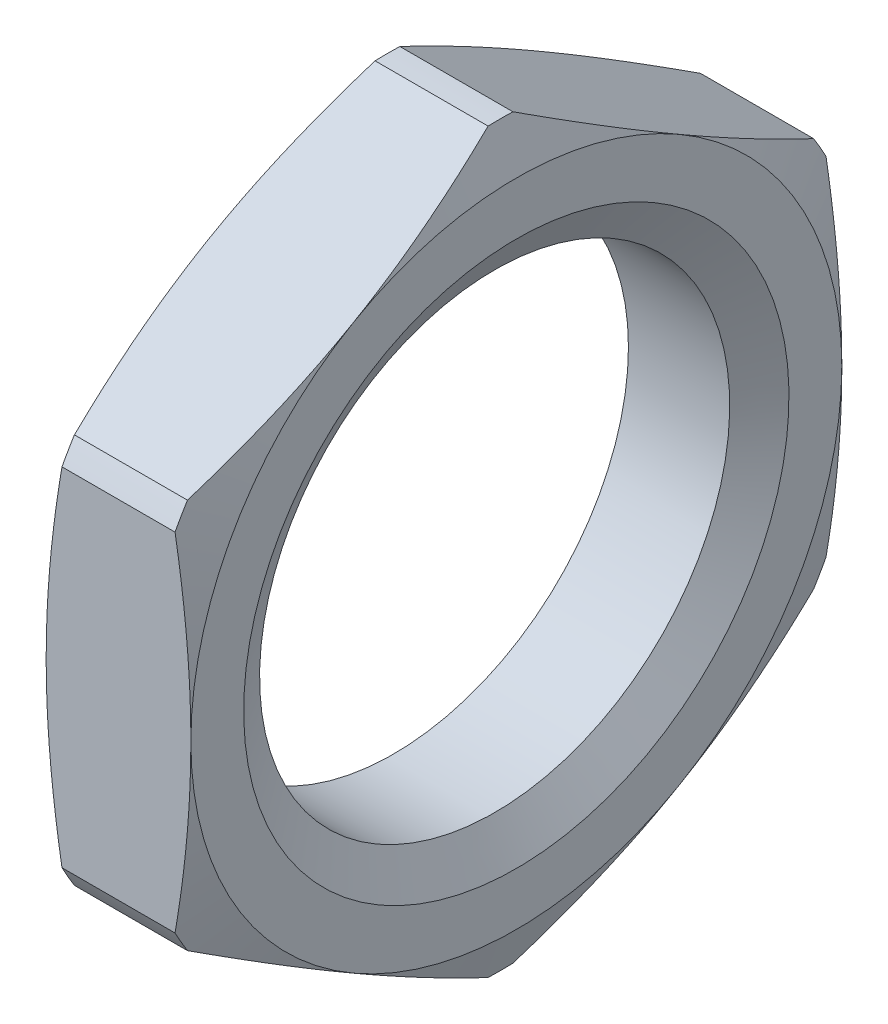
ISO-10303-21;
HEADER;
FILE_DESCRIPTION(('STEP AP214'),'2;1');
FILE_NAME('part.step','',(''),(''),'','','');
FILE_SCHEMA(('AUTOMOTIVE_DESIGN { 1 0 10303 214 1 1 1 1 }'));
ENDSEC;
DATA;
#1=APPLICATION_CONTEXT('core data for automotive mechanical design processes');
#2=APPLICATION_PROTOCOL_DEFINITION('international standard','automotive_design',2000,#1);
#3=PRODUCT_CONTEXT('',#1,'mechanical');
#4=PRODUCT('Part','Part','',(#3));
#5=PRODUCT_RELATED_PRODUCT_CATEGORY('part','',(#4));
#6=PRODUCT_DEFINITION_FORMATION('','',#4);
#7=PRODUCT_DEFINITION_CONTEXT('part definition',#1,'design');
#8=PRODUCT_DEFINITION('design','',#6,#7);
#9=PRODUCT_DEFINITION_SHAPE('','',#8);
#10=(LENGTH_UNIT() NAMED_UNIT(*) SI_UNIT(.MILLI.,.METRE.));
#11=(NAMED_UNIT(*) PLANE_ANGLE_UNIT() SI_UNIT($,.RADIAN.));
#12=(NAMED_UNIT(*) SI_UNIT($,.STERADIAN.) SOLID_ANGLE_UNIT());
#13=UNCERTAINTY_MEASURE_WITH_UNIT(LENGTH_MEASURE(1.E-05),#10,'distance_accuracy_value','');
#14=(GEOMETRIC_REPRESENTATION_CONTEXT(3) GLOBAL_UNCERTAINTY_ASSIGNED_CONTEXT((#13)) GLOBAL_UNIT_ASSIGNED_CONTEXT((#10,
#11,#12)) REPRESENTATION_CONTEXT('',''));
#15=CARTESIAN_POINT('',(0.,0.,0.));
#16=DIRECTION('',(0.,0.,1.));
#17=DIRECTION('',(1.,0.,0.));
#18=AXIS2_PLACEMENT_3D('',#15,#16,#17);
#19=CARTESIAN_POINT('',(-8.5,0.,0.));
#20=DIRECTION('',(1.,0.,0.));
#21=DIRECTION('',(0.,0.866025403784439,-0.5));
#22=AXIS2_PLACEMENT_3D('',#19,#20,#21);
#23=CYLINDRICAL_SURFACE('',#22,5.1);
#24=DIRECTION('',(-1.,0.,0.));
#25=VECTOR('',#24,1.);
#26=CARTESIAN_POINT('',(-8.5,2.4,-4.5));
#27=LINE('',#26,#25);
#28=CARTESIAN_POINT('',(-7.71838214055972,2.4,-4.5));
#29=VERTEX_POINT('',#28);
#30=CARTESIAN_POINT('',(-9.28161785944028,2.4,-4.5));
#31=VERTEX_POINT('',#30);
#32=EDGE_CURVE('E237',#29,#31,#27,.T.);
#33=ORIENTED_EDGE('',*,*,#32,.T.);
#34=CARTESIAN_POINT('',(-9.28161785944028,0.,0.));
#35=DIRECTION('',(-1.,0.,0.));
#36=DIRECTION('',(0.,-0.866025403784439,0.5));
#37=AXIS2_PLACEMENT_3D('',#34,#35,#36);
#38=CIRCLE('',#37,5.1);
#39=CARTESIAN_POINT('',(-9.28161785944028,2.69711431702997,-4.32846096908265));
#40=VERTEX_POINT('',#39);
#41=EDGE_CURVE('E201',#40,#31,#38,.T.);
#42=ORIENTED_EDGE('',*,*,#41,.F.);
#43=DIRECTION('',(1.,0.,0.));
#44=VECTOR('',#43,1.);
#45=CARTESIAN_POINT('',(-8.5,2.69711431702997,-4.32846096908265));
#46=LINE('',#45,#44);
#47=CARTESIAN_POINT('',(-7.71838214055972,2.69711431702997,-4.32846096908265));
#48=VERTEX_POINT('',#47);
#49=EDGE_CURVE('E362',#40,#48,#46,.T.);
#50=ORIENTED_EDGE('',*,*,#49,.T.);
#51=CARTESIAN_POINT('',(-7.71838214055972,0.,0.));
#52=DIRECTION('',(1.,0.,0.));
#53=DIRECTION('',(0.,-0.866025403784439,0.5));
#54=AXIS2_PLACEMENT_3D('',#51,#52,#53);
#55=CIRCLE('',#54,5.1);
#56=EDGE_CURVE('E11',#29,#48,#55,.T.);
#57=ORIENTED_EDGE('',*,*,#56,.F.);
#58=EDGE_LOOP('',(#33,#42,#50,#57));
#59=FACE_BOUND('',#58,.T.);
#60=ADVANCED_FACE('F16',(#59),#23,.T.);
#61=CARTESIAN_POINT('',(-7.60919107027986,0.,0.));
#62=DIRECTION('',(-1.,0.,0.));
#63=DIRECTION('',(0.,-0.866025403784439,0.5));
#64=AXIS2_PLACEMENT_3D('',#61,#62,#63);
#65=CONICAL_SURFACE('',#64,4.8,1.22173047639603);
#66=CARTESIAN_POINT('',(-7.5,0.,-4.5));
#67=CARTESIAN_POINT('',(-7.5,1.12499999999998,-4.5));
#68=CARTESIAN_POINT('',(-7.71838214055972,2.4,-4.5));
#69=(BOUNDED_CURVE() B_SPLINE_CURVE(2,(#66,#67,#68),.UNSPECIFIED.,.F.,
.F.) B_SPLINE_CURVE_WITH_KNOTS((3,3),(0.241214330526774,0.482428661053548),
.UNSPECIFIED.) CURVE() GEOMETRIC_REPRESENTATION_ITEM() RATIONAL_B_SPLINE_CURVE((1.,
1.03279555898864,1.)) REPRESENTATION_ITEM(''));
#70=CARTESIAN_POINT('',(-7.5,0.,-4.5));
#71=VERTEX_POINT('',#70);
#72=EDGE_CURVE('E421',#71,#29,#69,.T.);
#73=ORIENTED_EDGE('',*,*,#72,.T.);
#74=ORIENTED_EDGE('',*,*,#56,.T.);
#75=CARTESIAN_POINT('',(-7.71838214055972,2.69711431702997,-4.32846096908265));
#76=CARTESIAN_POINT('',(-7.50000000000001,3.33461431702997,-3.22427857925749));
#77=CARTESIAN_POINT('',(-7.5,3.89711431702997,-2.25));
#78=(BOUNDED_CURVE() B_SPLINE_CURVE(2,(#75,#76,#77),.UNSPECIFIED.,.F.,
.F.) B_SPLINE_CURVE_WITH_KNOTS((3,3),(0.,0.241214330526774),
.UNSPECIFIED.) CURVE() GEOMETRIC_REPRESENTATION_ITEM() RATIONAL_B_SPLINE_CURVE((1.,
1.03279555898865,1.)) REPRESENTATION_ITEM(''));
#79=CARTESIAN_POINT('',(-7.5,3.89711431702997,-2.25));
#80=VERTEX_POINT('',#79);
#81=EDGE_CURVE('E353',#48,#80,#78,.T.);
#82=ORIENTED_EDGE('',*,*,#81,.T.);
#83=CARTESIAN_POINT('',(-7.5,0.,0.));
#84=DIRECTION('',(-1.,0.,0.));
#85=DIRECTION('',(0.,-0.866025403784439,0.5));
#86=AXIS2_PLACEMENT_3D('',#83,#84,#85);
#87=CIRCLE('',#86,4.5);
#88=EDGE_CURVE('E337',#80,#71,#87,.T.);
#89=ORIENTED_EDGE('',*,*,#88,.T.);
#90=EDGE_LOOP('',(#73,#74,#82,#89));
#91=FACE_BOUND('',#90,.T.);
#92=ADVANCED_FACE('F628',(#91),#65,.T.);
#93=CARTESIAN_POINT('',(-9.5,2.20836477965031,-1.275));
#94=DIRECTION('',(-1.,0.,0.));
#95=DIRECTION('',(0.,0.866025403784439,-0.5));
#96=AXIS2_PLACEMENT_3D('',#93,#94,#95);
#97=PLANE('',#96);
#98=CARTESIAN_POINT('',(-9.5,0.,0.));
#99=DIRECTION('',(-1.,0.,0.));
#100=DIRECTION('',(0.,0.866025403784439,-0.5));
#101=AXIS2_PLACEMENT_3D('',#98,#99,#100);
#102=CIRCLE('',#101,3.76961524227066);
#103=CARTESIAN_POINT('',(-9.5,-3.26458256229944,1.88480762113533));
#104=VERTEX_POINT('',#103);
#105=EDGE_CURVE('E29',#104,#104,#102,.T.);
#106=ORIENTED_EDGE('',*,*,#105,.F.);
#107=EDGE_LOOP('',(#106));
#108=FACE_BOUND('',#107,.T.);
#109=CARTESIAN_POINT('',(-9.5,0.,0.));
#110=DIRECTION('',(1.,0.,0.));
#111=DIRECTION('',(0.,-0.866025403784439,0.5));
#112=AXIS2_PLACEMENT_3D('',#109,#110,#111);
#113=CIRCLE('',#112,4.5);
#114=CARTESIAN_POINT('',(-9.5,3.89711431702997,-2.25));
#115=VERTEX_POINT('',#114);
#116=CARTESIAN_POINT('',(-9.5,3.89711431702997,2.25));
#117=VERTEX_POINT('',#116);
#118=EDGE_CURVE('E274',#115,#117,#113,.T.);
#119=ORIENTED_EDGE('',*,*,#118,.F.);
#120=CARTESIAN_POINT('',(-9.5,0.,0.));
#121=DIRECTION('',(1.,0.,0.));
#122=DIRECTION('',(0.,-0.866025403784439,0.5));
#123=AXIS2_PLACEMENT_3D('',#120,#121,#122);
#124=CIRCLE('',#123,4.5);
#125=CARTESIAN_POINT('',(-9.5,0.,-4.5));
#126=VERTEX_POINT('',#125);
#127=EDGE_CURVE('E196',#126,#115,#124,.T.);
#128=ORIENTED_EDGE('',*,*,#127,.F.);
#129=CARTESIAN_POINT('',(-9.5,0.,0.));
#130=DIRECTION('',(1.,0.,0.));
#131=DIRECTION('',(0.,-0.866025403784439,0.5));
#132=AXIS2_PLACEMENT_3D('',#129,#130,#131);
#133=CIRCLE('',#132,4.5);
#134=CARTESIAN_POINT('',(-9.5,-3.89711431702999,-2.25));
#135=VERTEX_POINT('',#134);
#136=EDGE_CURVE('E297',#135,#126,#133,.T.);
#137=ORIENTED_EDGE('',*,*,#136,.F.);
#138=CARTESIAN_POINT('',(-9.5,0.,0.));
#139=DIRECTION('',(1.,0.,0.));
#140=DIRECTION('',(0.,-0.866025403784439,0.5));
#141=AXIS2_PLACEMENT_3D('',#138,#139,#140);
#142=CIRCLE('',#141,4.5);
#143=CARTESIAN_POINT('',(-9.5,-3.89711431702999,2.25));
#144=VERTEX_POINT('',#143);
#145=EDGE_CURVE('E305',#144,#135,#142,.T.);
#146=ORIENTED_EDGE('',*,*,#145,.F.);
#147=CARTESIAN_POINT('',(-9.5,0.,0.));
#148=DIRECTION('',(1.,0.,0.));
#149=DIRECTION('',(0.,-0.866025403784439,0.5));
#150=AXIS2_PLACEMENT_3D('',#147,#148,#149);
#151=CIRCLE('',#150,4.5);
#152=CARTESIAN_POINT('',(-9.5,0.,4.5));
#153=VERTEX_POINT('',#152);
#154=EDGE_CURVE('E251',#153,#144,#151,.T.);
#155=ORIENTED_EDGE('',*,*,#154,.F.);
#156=CARTESIAN_POINT('',(-9.5,0.,0.));
#157=DIRECTION('',(1.,0.,0.));
#158=DIRECTION('',(0.,-0.866025403784439,0.5));
#159=AXIS2_PLACEMENT_3D('',#156,#157,#158);
#160=CIRCLE('',#159,4.5);
#161=EDGE_CURVE('E252',#117,#153,#160,.T.);
#162=ORIENTED_EDGE('',*,*,#161,.F.);
#163=EDGE_LOOP('',(#119,#128,#137,#146,#155,#162));
#164=FACE_BOUND('',#163,.T.);
#165=ADVANCED_FACE('F632',(#108,#164),#97,.T.);
#166=CARTESIAN_POINT('',(-9.35,0.,0.));
#167=DIRECTION('',(-1.,0.,0.));
#168=DIRECTION('',(0.,0.866025403784439,-0.5));
#169=AXIS2_PLACEMENT_3D('',#166,#167,#168);
#170=CONICAL_SURFACE('',#169,3.50980762113533,1.0471975511966);
#171=ORIENTED_EDGE('',*,*,#105,.T.);
#172=EDGE_LOOP('',(#171));
#173=FACE_BOUND('',#172,.T.);
#174=CARTESIAN_POINT('',(-9.2,0.,0.));
#175=DIRECTION('',(1.,0.,0.));
#176=DIRECTION('',(0.,0.866025403784439,-0.5));
#177=AXIS2_PLACEMENT_3D('',#174,#175,#176);
#178=CIRCLE('',#177,3.25);
#179=CARTESIAN_POINT('',(-9.2,-2.81458256229943,1.625));
#180=VERTEX_POINT('',#179);
#181=EDGE_CURVE('E228',#180,#180,#178,.T.);
#182=ORIENTED_EDGE('',*,*,#181,.T.);
#183=EDGE_LOOP('',(#182));
#184=FACE_BOUND('',#183,.T.);
#185=ADVANCED_FACE('F718',(#173,#184),#170,.F.);
#186=CARTESIAN_POINT('',(-7.5,2.20836477965031,-1.275));
#187=DIRECTION('',(1.,0.,0.));
#188=DIRECTION('',(0.,0.866025403784439,-0.5));
#189=AXIS2_PLACEMENT_3D('',#186,#187,#188);
#190=PLANE('',#189);
#191=CARTESIAN_POINT('',(-7.5,0.,0.));
#192=DIRECTION('',(1.,0.,0.));
#193=DIRECTION('',(0.,-0.866025403784439,0.5));
#194=AXIS2_PLACEMENT_3D('',#191,#192,#193);
#195=CIRCLE('',#194,3.76961524227066);
#196=CARTESIAN_POINT('',(-7.5,3.26458256229942,-1.88480762113533));
#197=VERTEX_POINT('',#196);
#198=EDGE_CURVE('E222',#197,#197,#195,.T.);
#199=ORIENTED_EDGE('',*,*,#198,.F.);
#200=EDGE_LOOP('',(#199));
#201=FACE_BOUND('',#200,.T.);
#202=ORIENTED_EDGE('',*,*,#88,.F.);
#203=CARTESIAN_POINT('',(-7.5,0.,0.));
#204=DIRECTION('',(-1.,0.,0.));
#205=DIRECTION('',(0.,-0.866025403784439,0.5));
#206=AXIS2_PLACEMENT_3D('',#203,#204,#205);
#207=CIRCLE('',#206,4.5);
#208=CARTESIAN_POINT('',(-7.5,3.89711431702997,2.25));
#209=VERTEX_POINT('',#208);
#210=EDGE_CURVE('E259',#209,#80,#207,.T.);
#211=ORIENTED_EDGE('',*,*,#210,.F.);
#212=CARTESIAN_POINT('',(-7.5,0.,0.));
#213=DIRECTION('',(-1.,0.,0.));
#214=DIRECTION('',(0.,-0.866025403784439,0.5));
#215=AXIS2_PLACEMENT_3D('',#212,#213,#214);
#216=CIRCLE('',#215,4.5);
#217=CARTESIAN_POINT('',(-7.5,0.,4.5));
#218=VERTEX_POINT('',#217);
#219=EDGE_CURVE('E290',#218,#209,#216,.T.);
#220=ORIENTED_EDGE('',*,*,#219,.F.);
#221=CARTESIAN_POINT('',(-7.5,0.,0.));
#222=DIRECTION('',(-1.,0.,0.));
#223=DIRECTION('',(0.,-0.866025403784439,0.5));
#224=AXIS2_PLACEMENT_3D('',#221,#222,#223);
#225=CIRCLE('',#224,4.5);
#226=CARTESIAN_POINT('',(-7.5,-3.89711431702999,2.25));
#227=VERTEX_POINT('',#226);
#228=EDGE_CURVE('E174',#227,#218,#225,.T.);
#229=ORIENTED_EDGE('',*,*,#228,.F.);
#230=CARTESIAN_POINT('',(-7.5,0.,0.));
#231=DIRECTION('',(-1.,0.,0.));
#232=DIRECTION('',(0.,-0.866025403784439,0.5));
#233=AXIS2_PLACEMENT_3D('',#230,#231,#232);
#234=CIRCLE('',#233,4.5);
#235=CARTESIAN_POINT('',(-7.5,-3.89711431702999,-2.25));
#236=VERTEX_POINT('',#235);
#237=EDGE_CURVE('E203',#236,#227,#234,.T.);
#238=ORIENTED_EDGE('',*,*,#237,.F.);
#239=CARTESIAN_POINT('',(-7.5,0.,0.));
#240=DIRECTION('',(-1.,0.,0.));
#241=DIRECTION('',(0.,-0.866025403784439,0.5));
#242=AXIS2_PLACEMENT_3D('',#239,#240,#241);
#243=CIRCLE('',#242,4.5);
#244=EDGE_CURVE('E207',#71,#236,#243,.T.);
#245=ORIENTED_EDGE('',*,*,#244,.F.);
#246=EDGE_LOOP('',(#202,#211,#220,#229,#238,#245));
#247=FACE_BOUND('',#246,.T.);
#248=ADVANCED_FACE('F603',(#201,#247),#190,.T.);
#249=CARTESIAN_POINT('',(5.062966730718,0.,0.));
#250=DIRECTION('',(-1.,0.,0.));
#251=DIRECTION('',(0.,-0.866025403784439,0.5));
#252=AXIS2_PLACEMENT_3D('',#249,#250,#251);
#253=CYLINDRICAL_SURFACE('',#252,3.25);
#254=CARTESIAN_POINT('',(-7.8,0.,0.));
#255=DIRECTION('',(-1.,0.,0.));
#256=DIRECTION('',(0.,-0.866025403784439,0.5));
#257=AXIS2_PLACEMENT_3D('',#254,#255,#256);
#258=CIRCLE('',#257,3.25);
#259=CARTESIAN_POINT('',(-7.8,2.81458256229941,-1.625));
#260=VERTEX_POINT('',#259);
#261=EDGE_CURVE('E229',#260,#260,#258,.T.);
#262=ORIENTED_EDGE('',*,*,#261,.F.);
#263=EDGE_LOOP('',(#262));
#264=FACE_BOUND('',#263,.T.);
#265=ORIENTED_EDGE('',*,*,#181,.F.);
#266=EDGE_LOOP('',(#265));
#267=FACE_BOUND('',#266,.T.);
#268=ADVANCED_FACE('F659',(#264,#267),#253,.F.);
#269=CARTESIAN_POINT('',(-7.65,0.,0.));
#270=DIRECTION('',(1.,0.,0.));
#271=DIRECTION('',(0.,-0.866025403784439,0.5));
#272=AXIS2_PLACEMENT_3D('',#269,#270,#271);
#273=CONICAL_SURFACE('',#272,3.50980762113533,1.0471975511966);
#274=ORIENTED_EDGE('',*,*,#198,.T.);
#275=EDGE_LOOP('',(#274));
#276=FACE_BOUND('',#275,.T.);
#277=ORIENTED_EDGE('',*,*,#261,.T.);
#278=EDGE_LOOP('',(#277));
#279=FACE_BOUND('',#278,.T.);
#280=ADVANCED_FACE('F662',(#276,#279),#273,.F.);
#281=CARTESIAN_POINT('',(-9.39080892972014,0.,0.));
#282=DIRECTION('',(1.,0.,0.));
#283=DIRECTION('',(0.,-0.866025403784439,0.5));
#284=AXIS2_PLACEMENT_3D('',#281,#282,#283);
#285=CONICAL_SURFACE('',#284,4.8,1.22173047639603);
#286=CARTESIAN_POINT('',(-9.28161785944028,2.4,-4.5));
#287=CARTESIAN_POINT('',(-9.5,1.125,-4.5));
#288=CARTESIAN_POINT('',(-9.5,0.,-4.5));
#289=(BOUNDED_CURVE() B_SPLINE_CURVE(2,(#286,#287,#288),.UNSPECIFIED.,.F.,
.F.) B_SPLINE_CURVE_WITH_KNOTS((3,3),(0.,0.241214330526773),
.UNSPECIFIED.) CURVE() GEOMETRIC_REPRESENTATION_ITEM() RATIONAL_B_SPLINE_CURVE((1.,
1.03279555898864,1.)) REPRESENTATION_ITEM(''));
#290=EDGE_CURVE('E284',#31,#126,#289,.T.);
#291=ORIENTED_EDGE('',*,*,#290,.T.);
#292=ORIENTED_EDGE('',*,*,#127,.T.);
#293=CARTESIAN_POINT('',(-9.5,3.89711431702997,-2.25));
#294=CARTESIAN_POINT('',(-9.5,3.33461431702997,-3.22427857925748));
#295=CARTESIAN_POINT('',(-9.28161785944028,2.69711431702997,-4.32846096908265));
#296=(BOUNDED_CURVE() B_SPLINE_CURVE(2,(#293,#294,#295),.UNSPECIFIED.,.F.,
.F.) B_SPLINE_CURVE_WITH_KNOTS((3,3),(0.241214330526774,0.482428661053547),
.UNSPECIFIED.) CURVE() GEOMETRIC_REPRESENTATION_ITEM() RATIONAL_B_SPLINE_CURVE((1.,
1.03279555898864,1.)) REPRESENTATION_ITEM(''));
#297=EDGE_CURVE('E202',#115,#40,#296,.T.);
#298=ORIENTED_EDGE('',*,*,#297,.T.);
#299=ORIENTED_EDGE('',*,*,#41,.T.);
#300=EDGE_LOOP('',(#291,#292,#298,#299));
#301=FACE_BOUND('',#300,.T.);
#302=ADVANCED_FACE('F667',(#301),#285,.T.);
#303=CARTESIAN_POINT('',(-7.5,3.89711431702997,-2.25));
#304=DIRECTION('',(0.,-0.866025403784439,0.5));
#305=DIRECTION('',(0.,-0.5,-0.866025403784439));
#306=AXIS2_PLACEMENT_3D('',#303,#304,#305);
#307=PLANE('',#306);
#308=CARTESIAN_POINT('',(-7.5,3.89711431702997,-2.25));
#309=CARTESIAN_POINT('',(-7.50000000000001,4.45961431702996,-1.27572142074251));
#310=CARTESIAN_POINT('',(-7.71838214055972,5.09711431702997,-0.171539030917346));
#311=(BOUNDED_CURVE() B_SPLINE_CURVE(2,(#308,#309,#310),.UNSPECIFIED.,.F.,
.F.) B_SPLINE_CURVE_WITH_KNOTS((3,3),(0.241214330526774,0.482428661053548),
.UNSPECIFIED.) CURVE() GEOMETRIC_REPRESENTATION_ITEM() RATIONAL_B_SPLINE_CURVE((1.,
1.03279555898865,1.)) REPRESENTATION_ITEM(''));
#312=CARTESIAN_POINT('',(-7.71838214055972,5.09711431702997,-0.171539030917346));
#313=VERTEX_POINT('',#312);
#314=EDGE_CURVE('E266',#80,#313,#311,.T.);
#315=ORIENTED_EDGE('',*,*,#314,.F.);
#316=ORIENTED_EDGE('',*,*,#81,.F.);
#317=ORIENTED_EDGE('',*,*,#49,.F.);
#318=ORIENTED_EDGE('',*,*,#297,.F.);
#319=CARTESIAN_POINT('',(-9.28161785944028,5.09711431702997,-0.171539030917346));
#320=CARTESIAN_POINT('',(-9.5,4.45961431702996,-1.27572142074251));
#321=CARTESIAN_POINT('',(-9.5,3.89711431702997,-2.25));
#322=(BOUNDED_CURVE() B_SPLINE_CURVE(2,(#319,#320,#321),.UNSPECIFIED.,.F.,
.F.) B_SPLINE_CURVE_WITH_KNOTS((3,3),(0.,0.241214330526774),
.UNSPECIFIED.) CURVE() GEOMETRIC_REPRESENTATION_ITEM() RATIONAL_B_SPLINE_CURVE((1.,
1.03279555898864,1.)) REPRESENTATION_ITEM(''));
#323=CARTESIAN_POINT('',(-9.28161785944028,5.09711431702997,-0.171539030917346));
#324=VERTEX_POINT('',#323);
#325=EDGE_CURVE('E268',#324,#115,#322,.T.);
#326=ORIENTED_EDGE('',*,*,#325,.F.);
#327=DIRECTION('',(-1.,0.,0.));
#328=VECTOR('',#327,1.);
#329=CARTESIAN_POINT('',(-8.5,5.09711431702997,-0.171539030917346));
#330=LINE('',#329,#328);
#331=EDGE_CURVE('E313',#313,#324,#330,.T.);
#332=ORIENTED_EDGE('',*,*,#331,.F.);
#333=EDGE_LOOP('',(#315,#316,#317,#318,#326,#332));
#334=FACE_BOUND('',#333,.T.);
#335=ADVANCED_FACE('F556',(#334),#307,.F.);
#336=CARTESIAN_POINT('',(-7.60919107027986,0.,0.));
#337=DIRECTION('',(-1.,0.,0.));
#338=DIRECTION('',(0.,-0.866025403784439,0.5));
#339=AXIS2_PLACEMENT_3D('',#336,#337,#338);
#340=CONICAL_SURFACE('',#339,4.8,1.22173047639603);
#341=CARTESIAN_POINT('',(-7.71838214055972,-2.4,-4.5));
#342=CARTESIAN_POINT('',(-7.5,-1.12500000000002,-4.5));
#343=CARTESIAN_POINT('',(-7.5,0.,-4.5));
#344=(BOUNDED_CURVE() B_SPLINE_CURVE(2,(#341,#342,#343),.UNSPECIFIED.,.F.,
.F.) B_SPLINE_CURVE_WITH_KNOTS((3,3),(0.,0.241214330526774),
.UNSPECIFIED.) CURVE() GEOMETRIC_REPRESENTATION_ITEM() RATIONAL_B_SPLINE_CURVE((1.,
1.03279555898864,1.)) REPRESENTATION_ITEM(''));
#345=CARTESIAN_POINT('',(-7.71838214055972,-2.4,-4.5));
#346=VERTEX_POINT('',#345);
#347=EDGE_CURVE('E323',#346,#71,#344,.T.);
#348=ORIENTED_EDGE('',*,*,#347,.T.);
#349=ORIENTED_EDGE('',*,*,#244,.T.);
#350=CARTESIAN_POINT('',(-7.5,-3.89711431702999,-2.25));
#351=CARTESIAN_POINT('',(-7.5,-3.33461431702999,-3.22427857925748));
#352=CARTESIAN_POINT('',(-7.71838214055972,-2.69711431702999,-4.32846096908265));
#353=(BOUNDED_CURVE() B_SPLINE_CURVE(2,(#350,#351,#352),.UNSPECIFIED.,.F.,
.F.) B_SPLINE_CURVE_WITH_KNOTS((3,3),(0.241214330526774,0.482428661053547),
.UNSPECIFIED.) CURVE() GEOMETRIC_REPRESENTATION_ITEM() RATIONAL_B_SPLINE_CURVE((1.,
1.03279555898864,1.)) REPRESENTATION_ITEM(''));
#354=CARTESIAN_POINT('',(-7.71838214055972,-2.69711431702999,-4.32846096908265));
#355=VERTEX_POINT('',#354);
#356=EDGE_CURVE('E230',#236,#355,#353,.T.);
#357=ORIENTED_EDGE('',*,*,#356,.T.);
#358=CARTESIAN_POINT('',(-7.71838214055972,0.,0.));
#359=DIRECTION('',(1.,0.,0.));
#360=DIRECTION('',(0.,-0.866025403784439,0.5));
#361=AXIS2_PLACEMENT_3D('',#358,#359,#360);
#362=CIRCLE('',#361,5.1);
#363=EDGE_CURVE('E267',#355,#346,#362,.T.);
#364=ORIENTED_EDGE('',*,*,#363,.T.);
#365=EDGE_LOOP('',(#348,#349,#357,#364));
#366=FACE_BOUND('',#365,.T.);
#367=ADVANCED_FACE('F597',(#366),#340,.T.);
#368=CARTESIAN_POINT('',(-7.60919107027986,0.,0.));
#369=DIRECTION('',(-1.,0.,0.));
#370=DIRECTION('',(0.,-0.866025403784439,0.5));
#371=AXIS2_PLACEMENT_3D('',#368,#369,#370);
#372=CONICAL_SURFACE('',#371,4.8,1.22173047639603);
#373=CARTESIAN_POINT('',(-7.71838214055972,-5.09711431702998,-0.171539030917345));
#374=CARTESIAN_POINT('',(-7.5,-4.45961431702998,-1.27572142074251));
#375=CARTESIAN_POINT('',(-7.5,-3.89711431702999,-2.25));
#376=(BOUNDED_CURVE() B_SPLINE_CURVE(2,(#373,#374,#375),.UNSPECIFIED.,.F.,
.F.) B_SPLINE_CURVE_WITH_KNOTS((3,3),(0.,0.241214330526774),
.UNSPECIFIED.) CURVE() GEOMETRIC_REPRESENTATION_ITEM() RATIONAL_B_SPLINE_CURVE((1.,
1.03279555898864,1.)) REPRESENTATION_ITEM(''));
#377=CARTESIAN_POINT('',(-7.71838214055972,-5.09711431702998,-0.171539030917345));
#378=VERTEX_POINT('',#377);
#379=EDGE_CURVE('E236',#378,#236,#376,.T.);
#380=ORIENTED_EDGE('',*,*,#379,.T.);
#381=ORIENTED_EDGE('',*,*,#237,.T.);
#382=CARTESIAN_POINT('',(-7.5,-3.89711431702999,2.25));
#383=CARTESIAN_POINT('',(-7.50000000000001,-4.45961431702998,1.27572142074251));
#384=CARTESIAN_POINT('',(-7.71838214055972,-5.09711431702999,0.171539030917346));
#385=(BOUNDED_CURVE() B_SPLINE_CURVE(2,(#382,#383,#384),.UNSPECIFIED.,.F.,
.F.) B_SPLINE_CURVE_WITH_KNOTS((3,3),(0.241214330526774,0.482428661053547),
.UNSPECIFIED.) CURVE() GEOMETRIC_REPRESENTATION_ITEM() RATIONAL_B_SPLINE_CURVE((1.,
1.03279555898865,1.)) REPRESENTATION_ITEM(''));
#386=CARTESIAN_POINT('',(-7.71838214055972,-5.09711431702999,0.171539030917346));
#387=VERTEX_POINT('',#386);
#388=EDGE_CURVE('E245',#227,#387,#385,.T.);
#389=ORIENTED_EDGE('',*,*,#388,.T.);
#390=CARTESIAN_POINT('',(-7.71838214055972,0.,0.));
#391=DIRECTION('',(1.,0.,0.));
#392=DIRECTION('',(0.,-0.866025403784439,0.5));
#393=AXIS2_PLACEMENT_3D('',#390,#391,#392);
#394=CIRCLE('',#393,5.1);
#395=EDGE_CURVE('E158',#387,#378,#394,.T.);
#396=ORIENTED_EDGE('',*,*,#395,.T.);
#397=EDGE_LOOP('',(#380,#381,#389,#396));
#398=FACE_BOUND('',#397,.T.);
#399=ADVANCED_FACE('F605',(#398),#372,.T.);
#400=CARTESIAN_POINT('',(-7.60919107027986,0.,0.));
#401=DIRECTION('',(-1.,0.,0.));
#402=DIRECTION('',(0.,-0.866025403784439,0.5));
#403=AXIS2_PLACEMENT_3D('',#400,#401,#402);
#404=CONICAL_SURFACE('',#403,4.8,1.22173047639603);
#405=CARTESIAN_POINT('',(-7.71838214055972,-2.69711431702999,4.32846096908265));
#406=CARTESIAN_POINT('',(-7.50000000000001,-3.33461431702999,3.22427857925749));
#407=CARTESIAN_POINT('',(-7.5,-3.89711431702999,2.25));
#408=(BOUNDED_CURVE() B_SPLINE_CURVE(2,(#405,#406,#407),.UNSPECIFIED.,.F.,
.F.) B_SPLINE_CURVE_WITH_KNOTS((3,3),(0.,0.241214330526774),
.UNSPECIFIED.) CURVE() GEOMETRIC_REPRESENTATION_ITEM() RATIONAL_B_SPLINE_CURVE((1.,
1.03279555898865,1.)) REPRESENTATION_ITEM(''));
#409=CARTESIAN_POINT('',(-7.71838214055972,-2.69711431702999,4.32846096908265));
#410=VERTEX_POINT('',#409);
#411=EDGE_CURVE('E395',#410,#227,#408,.T.);
#412=ORIENTED_EDGE('',*,*,#411,.T.);
#413=ORIENTED_EDGE('',*,*,#228,.T.);
#414=CARTESIAN_POINT('',(-7.5,0.,4.5));
#415=CARTESIAN_POINT('',(-7.5,-1.12500000000002,4.5));
#416=CARTESIAN_POINT('',(-7.71838214055972,-2.4,4.5));
#417=(BOUNDED_CURVE() B_SPLINE_CURVE(2,(#414,#415,#416),.UNSPECIFIED.,.F.,
.F.) B_SPLINE_CURVE_WITH_KNOTS((3,3),(0.241214330526775,0.482428661053547),
.UNSPECIFIED.) CURVE() GEOMETRIC_REPRESENTATION_ITEM() RATIONAL_B_SPLINE_CURVE((1.,
1.03279555898864,1.)) REPRESENTATION_ITEM(''));
#418=CARTESIAN_POINT('',(-7.71838214055972,-2.4,4.5));
#419=VERTEX_POINT('',#418);
#420=EDGE_CURVE('E165',#218,#419,#417,.T.);
#421=ORIENTED_EDGE('',*,*,#420,.T.);
#422=CARTESIAN_POINT('',(-7.71838214055972,0.,0.));
#423=DIRECTION('',(1.,0.,0.));
#424=DIRECTION('',(0.,-0.866025403784439,0.5));
#425=AXIS2_PLACEMENT_3D('',#422,#423,#424);
#426=CIRCLE('',#425,5.1);
#427=EDGE_CURVE('E146',#419,#410,#426,.T.);
#428=ORIENTED_EDGE('',*,*,#427,.T.);
#429=EDGE_LOOP('',(#412,#413,#421,#428));
#430=FACE_BOUND('',#429,.T.);
#431=ADVANCED_FACE('F172',(#430),#404,.T.);
#432=CARTESIAN_POINT('',(-7.60919107027986,0.,0.));
#433=DIRECTION('',(-1.,0.,0.));
#434=DIRECTION('',(0.,-0.866025403784439,0.5));
#435=AXIS2_PLACEMENT_3D('',#432,#433,#434);
#436=CONICAL_SURFACE('',#435,4.8,1.22173047639603);
#437=CARTESIAN_POINT('',(-7.71838214055972,2.4,4.5));
#438=CARTESIAN_POINT('',(-7.5,1.125,4.5));
#439=CARTESIAN_POINT('',(-7.5,0.,4.5));
#440=(BOUNDED_CURVE() B_SPLINE_CURVE(2,(#437,#438,#439),.UNSPECIFIED.,.F.,
.F.) B_SPLINE_CURVE_WITH_KNOTS((3,3),(0.,0.241214330526773),
.UNSPECIFIED.) CURVE() GEOMETRIC_REPRESENTATION_ITEM() RATIONAL_B_SPLINE_CURVE((1.,
1.03279555898864,1.)) REPRESENTATION_ITEM(''));
#441=CARTESIAN_POINT('',(-7.71838214055972,2.4,4.5));
#442=VERTEX_POINT('',#441);
#443=EDGE_CURVE('E177',#442,#218,#440,.T.);
#444=ORIENTED_EDGE('',*,*,#443,.T.);
#445=ORIENTED_EDGE('',*,*,#219,.T.);
#446=CARTESIAN_POINT('',(-7.5,3.89711431702997,2.25));
#447=CARTESIAN_POINT('',(-7.5,3.33461431702997,3.22427857925748));
#448=CARTESIAN_POINT('',(-7.71838214055972,2.69711431702997,4.32846096908266));
#449=(BOUNDED_CURVE() B_SPLINE_CURVE(2,(#446,#447,#448),.UNSPECIFIED.,.F.,
.F.) B_SPLINE_CURVE_WITH_KNOTS((3,3),(0.241214330526774,0.482428661053547),
.UNSPECIFIED.) CURVE() GEOMETRIC_REPRESENTATION_ITEM() RATIONAL_B_SPLINE_CURVE((1.,
1.03279555898864,1.)) REPRESENTATION_ITEM(''));
#450=CARTESIAN_POINT('',(-7.71838214055972,2.69711431702996,4.32846096908265));
#451=VERTEX_POINT('',#450);
#452=EDGE_CURVE('E170',#209,#451,#449,.T.);
#453=ORIENTED_EDGE('',*,*,#452,.T.);
#454=CARTESIAN_POINT('',(-7.71838214055972,0.,0.));
#455=DIRECTION('',(1.,0.,0.));
#456=DIRECTION('',(0.,-0.866025403784439,0.5));
#457=AXIS2_PLACEMENT_3D('',#454,#455,#456);
#458=CIRCLE('',#457,5.1);
#459=EDGE_CURVE('E159',#451,#442,#458,.T.);
#460=ORIENTED_EDGE('',*,*,#459,.T.);
#461=EDGE_LOOP('',(#444,#445,#453,#460));
#462=FACE_BOUND('',#461,.T.);
#463=ADVANCED_FACE('F623',(#462),#436,.T.);
#464=CARTESIAN_POINT('',(-7.60919107027986,0.,0.));
#465=DIRECTION('',(-1.,0.,0.));
#466=DIRECTION('',(0.,-0.866025403784439,0.5));
#467=AXIS2_PLACEMENT_3D('',#464,#465,#466);
#468=CONICAL_SURFACE('',#467,4.8,1.22173047639603);
#469=CARTESIAN_POINT('',(-7.71838214055972,5.09711431702996,0.171539030917345));
#470=CARTESIAN_POINT('',(-7.5,4.45961431702996,1.27572142074251));
#471=CARTESIAN_POINT('',(-7.5,3.89711431702997,2.25));
#472=(BOUNDED_CURVE() B_SPLINE_CURVE(2,(#469,#470,#471),.UNSPECIFIED.,.F.,
.F.) B_SPLINE_CURVE_WITH_KNOTS((3,3),(0.,0.241214330526774),
.UNSPECIFIED.) CURVE() GEOMETRIC_REPRESENTATION_ITEM() RATIONAL_B_SPLINE_CURVE((1.,
1.03279555898866,1.)) REPRESENTATION_ITEM(''));
#473=CARTESIAN_POINT('',(-7.71838214055972,5.09711431702996,0.171539030917345));
#474=VERTEX_POINT('',#473);
#475=EDGE_CURVE('E372',#474,#209,#472,.T.);
#476=ORIENTED_EDGE('',*,*,#475,.T.);
#477=ORIENTED_EDGE('',*,*,#210,.T.);
#478=ORIENTED_EDGE('',*,*,#314,.T.);
#479=CARTESIAN_POINT('',(-7.71838214055972,0.,0.));
#480=DIRECTION('',(1.,0.,0.));
#481=DIRECTION('',(0.,-0.866025403784439,0.5));
#482=AXIS2_PLACEMENT_3D('',#479,#480,#481);
#483=CIRCLE('',#482,5.1);
#484=EDGE_CURVE('E300',#313,#474,#483,.T.);
#485=ORIENTED_EDGE('',*,*,#484,.T.);
#486=EDGE_LOOP('',(#476,#477,#478,#485));
#487=FACE_BOUND('',#486,.T.);
#488=ADVANCED_FACE('F672',(#487),#468,.T.);
#489=CARTESIAN_POINT('',(-8.5,0.,0.));
#490=DIRECTION('',(1.,0.,0.));
#491=DIRECTION('',(0.,0.866025403784439,-0.5));
#492=AXIS2_PLACEMENT_3D('',#489,#490,#491);
#493=CYLINDRICAL_SURFACE('',#492,5.1);
#494=DIRECTION('',(1.,0.,0.));
#495=VECTOR('',#494,1.);
#496=CARTESIAN_POINT('',(-8.5,-2.4,-4.5));
#497=LINE('',#496,#495);
#498=CARTESIAN_POINT('',(-9.28161785944028,-2.4,-4.5));
#499=VERTEX_POINT('',#498);
#500=EDGE_CURVE('E285',#499,#346,#497,.T.);
#501=ORIENTED_EDGE('',*,*,#500,.T.);
#502=ORIENTED_EDGE('',*,*,#363,.F.);
#503=DIRECTION('',(-1.,0.,0.));
#504=VECTOR('',#503,1.);
#505=CARTESIAN_POINT('',(-8.5,-2.69711431702999,-4.32846096908265));
#506=LINE('',#505,#504);
#507=CARTESIAN_POINT('',(-9.28161785944028,-2.69711431702999,-4.32846096908265));
#508=VERTEX_POINT('',#507);
#509=EDGE_CURVE('E238',#355,#508,#506,.T.);
#510=ORIENTED_EDGE('',*,*,#509,.T.);
#511=CARTESIAN_POINT('',(-9.28161785944028,0.,0.));
#512=DIRECTION('',(-1.,0.,0.));
#513=DIRECTION('',(0.,-0.866025403784439,0.5));
#514=AXIS2_PLACEMENT_3D('',#511,#512,#513);
#515=CIRCLE('',#514,5.1);
#516=EDGE_CURVE('E301',#499,#508,#515,.T.);
#517=ORIENTED_EDGE('',*,*,#516,.F.);
#518=EDGE_LOOP('',(#501,#502,#510,#517));
#519=FACE_BOUND('',#518,.T.);
#520=ADVANCED_FACE('F595',(#519),#493,.T.);
#521=CARTESIAN_POINT('',(-8.5,0.,0.));
#522=DIRECTION('',(1.,0.,0.));
#523=DIRECTION('',(0.,0.866025403784439,-0.5));
#524=AXIS2_PLACEMENT_3D('',#521,#522,#523);
#525=CYLINDRICAL_SURFACE('',#524,5.1);
#526=DIRECTION('',(1.,0.,0.));
#527=VECTOR('',#526,1.);
#528=CARTESIAN_POINT('',(-8.5,-5.09711431702998,-0.171539030917345));
#529=LINE('',#528,#527);
#530=CARTESIAN_POINT('',(-9.28161785944028,-5.09711431702998,-0.171539030917345));
#531=VERTEX_POINT('',#530);
#532=EDGE_CURVE('E475',#531,#378,#529,.T.);
#533=ORIENTED_EDGE('',*,*,#532,.T.);
#534=ORIENTED_EDGE('',*,*,#395,.F.);
#535=DIRECTION('',(-1.,0.,0.));
#536=VECTOR('',#535,1.);
#537=CARTESIAN_POINT('',(-8.5,-5.09711431702999,0.171539030917346));
#538=LINE('',#537,#536);
#539=CARTESIAN_POINT('',(-9.28161785944028,-5.09711431702999,0.171539030917346));
#540=VERTEX_POINT('',#539);
#541=EDGE_CURVE('E178',#387,#540,#538,.T.);
#542=ORIENTED_EDGE('',*,*,#541,.T.);
#543=CARTESIAN_POINT('',(-9.28161785944028,0.,0.));
#544=DIRECTION('',(-1.,0.,0.));
#545=DIRECTION('',(0.,-0.866025403784439,0.5));
#546=AXIS2_PLACEMENT_3D('',#543,#544,#545);
#547=CIRCLE('',#546,5.1);
#548=EDGE_CURVE('E307',#531,#540,#547,.T.);
#549=ORIENTED_EDGE('',*,*,#548,.F.);
#550=EDGE_LOOP('',(#533,#534,#542,#549));
#551=FACE_BOUND('',#550,.T.);
#552=ADVANCED_FACE('F499',(#551),#525,.T.);
#553=CARTESIAN_POINT('',(-8.5,0.,0.));
#554=DIRECTION('',(1.,0.,0.));
#555=DIRECTION('',(0.,0.866025403784439,-0.5));
#556=AXIS2_PLACEMENT_3D('',#553,#554,#555);
#557=CYLINDRICAL_SURFACE('',#556,5.1);
#558=DIRECTION('',(1.,0.,0.));
#559=VECTOR('',#558,1.);
#560=CARTESIAN_POINT('',(-8.5,-2.69711431702999,4.32846096908265));
#561=LINE('',#560,#559);
#562=CARTESIAN_POINT('',(-9.28161785944028,-2.69711431702999,4.32846096908265));
#563=VERTEX_POINT('',#562);
#564=EDGE_CURVE('E152',#563,#410,#561,.T.);
#565=ORIENTED_EDGE('',*,*,#564,.T.);
#566=ORIENTED_EDGE('',*,*,#427,.F.);
#567=DIRECTION('',(-1.,0.,0.));
#568=VECTOR('',#567,1.);
#569=CARTESIAN_POINT('',(-8.5,-2.4,4.5));
#570=LINE('',#569,#568);
#571=CARTESIAN_POINT('',(-9.28161785944028,-2.4,4.5));
#572=VERTEX_POINT('',#571);
#573=EDGE_CURVE('E149',#419,#572,#570,.T.);
#574=ORIENTED_EDGE('',*,*,#573,.T.);
#575=CARTESIAN_POINT('',(-9.28161785944028,0.,0.));
#576=DIRECTION('',(-1.,0.,0.));
#577=DIRECTION('',(0.,-0.866025403784439,0.5));
#578=AXIS2_PLACEMENT_3D('',#575,#576,#577);
#579=CIRCLE('',#578,5.1);
#580=EDGE_CURVE('E247',#563,#572,#579,.T.);
#581=ORIENTED_EDGE('',*,*,#580,.F.);
#582=EDGE_LOOP('',(#565,#566,#574,#581));
#583=FACE_BOUND('',#582,.T.);
#584=ADVANCED_FACE('F148',(#583),#557,.T.);
#585=CARTESIAN_POINT('',(-8.5,0.,0.));
#586=DIRECTION('',(1.,0.,0.));
#587=DIRECTION('',(0.,0.866025403784439,-0.5));
#588=AXIS2_PLACEMENT_3D('',#585,#586,#587);
#589=CYLINDRICAL_SURFACE('',#588,5.1);
#590=DIRECTION('',(1.,0.,0.));
#591=VECTOR('',#590,1.);
#592=CARTESIAN_POINT('',(-8.5,2.4,4.5));
#593=LINE('',#592,#591);
#594=CARTESIAN_POINT('',(-9.28161785944028,2.4,4.5));
#595=VERTEX_POINT('',#594);
#596=EDGE_CURVE('E184',#595,#442,#593,.T.);
#597=ORIENTED_EDGE('',*,*,#596,.T.);
#598=ORIENTED_EDGE('',*,*,#459,.F.);
#599=DIRECTION('',(-1.,0.,0.));
#600=VECTOR('',#599,1.);
#601=CARTESIAN_POINT('',(-8.5,2.69711431702996,4.32846096908265));
#602=LINE('',#601,#600);
#603=CARTESIAN_POINT('',(-9.28161785944028,2.69711431702996,4.32846096908265));
#604=VERTEX_POINT('',#603);
#605=EDGE_CURVE('E316',#451,#604,#602,.T.);
#606=ORIENTED_EDGE('',*,*,#605,.T.);
#607=CARTESIAN_POINT('',(-9.28161785944028,0.,0.));
#608=DIRECTION('',(-1.,0.,0.));
#609=DIRECTION('',(0.,-0.866025403784439,0.5));
#610=AXIS2_PLACEMENT_3D('',#607,#608,#609);
#611=CIRCLE('',#610,5.1);
#612=EDGE_CURVE('E341',#595,#604,#611,.T.);
#613=ORIENTED_EDGE('',*,*,#612,.F.);
#614=EDGE_LOOP('',(#597,#598,#606,#613));
#615=FACE_BOUND('',#614,.T.);
#616=ADVANCED_FACE('F645',(#615),#589,.T.);
#617=CARTESIAN_POINT('',(-8.5,0.,0.));
#618=DIRECTION('',(1.,0.,0.));
#619=DIRECTION('',(0.,0.866025403784439,-0.5));
#620=AXIS2_PLACEMENT_3D('',#617,#618,#619);
#621=CYLINDRICAL_SURFACE('',#620,5.1);
#622=DIRECTION('',(1.,0.,0.));
#623=VECTOR('',#622,1.);
#624=CARTESIAN_POINT('',(-8.5,5.09711431702996,0.171539030917345));
#625=LINE('',#624,#623);
#626=CARTESIAN_POINT('',(-9.28161785944028,5.09711431702996,0.171539030917345));
#627=VERTEX_POINT('',#626);
#628=EDGE_CURVE('E378',#627,#474,#625,.T.);
#629=ORIENTED_EDGE('',*,*,#628,.T.);
#630=ORIENTED_EDGE('',*,*,#484,.F.);
#631=ORIENTED_EDGE('',*,*,#331,.T.);
#632=CARTESIAN_POINT('',(-9.28161785944028,0.,0.));
#633=DIRECTION('',(-1.,0.,0.));
#634=DIRECTION('',(0.,-0.866025403784439,0.5));
#635=AXIS2_PLACEMENT_3D('',#632,#633,#634);
#636=CIRCLE('',#635,5.1);
#637=EDGE_CURVE('E275',#627,#324,#636,.T.);
#638=ORIENTED_EDGE('',*,*,#637,.F.);
#639=EDGE_LOOP('',(#629,#630,#631,#638));
#640=FACE_BOUND('',#639,.T.);
#641=ADVANCED_FACE('F552',(#640),#621,.T.);
#642=CARTESIAN_POINT('',(-9.39080892972014,0.,0.));
#643=DIRECTION('',(1.,0.,0.));
#644=DIRECTION('',(0.,-0.866025403784439,0.5));
#645=AXIS2_PLACEMENT_3D('',#642,#643,#644);
#646=CONICAL_SURFACE('',#645,4.8,1.22173047639603);
#647=CARTESIAN_POINT('',(-9.5,0.,-4.5));
#648=CARTESIAN_POINT('',(-9.5,-1.12500000000002,-4.50000000000001));
#649=CARTESIAN_POINT('',(-9.28161785944028,-2.4,-4.5));
#650=(BOUNDED_CURVE() B_SPLINE_CURVE(2,(#647,#648,#649),.UNSPECIFIED.,.F.,
.F.) B_SPLINE_CURVE_WITH_KNOTS((3,3),(0.241214330526773,0.482428661053547),
.UNSPECIFIED.) CURVE() GEOMETRIC_REPRESENTATION_ITEM() RATIONAL_B_SPLINE_CURVE((1.,
1.03279555898865,1.)) REPRESENTATION_ITEM(''));
#651=EDGE_CURVE('E276',#126,#499,#650,.T.);
#652=ORIENTED_EDGE('',*,*,#651,.T.);
#653=ORIENTED_EDGE('',*,*,#516,.T.);
#654=CARTESIAN_POINT('',(-9.28161785944028,-2.69711431702999,-4.32846096908265));
#655=CARTESIAN_POINT('',(-9.5,-3.33461431702999,-3.22427857925749));
#656=CARTESIAN_POINT('',(-9.5,-3.89711431702999,-2.25));
#657=(BOUNDED_CURVE() B_SPLINE_CURVE(2,(#654,#655,#656),.UNSPECIFIED.,.F.,
.F.) B_SPLINE_CURVE_WITH_KNOTS((3,3),(0.,0.241214330526774),
.UNSPECIFIED.) CURVE() GEOMETRIC_REPRESENTATION_ITEM() RATIONAL_B_SPLINE_CURVE((1.,
1.03279555898865,1.)) REPRESENTATION_ITEM(''));
#658=EDGE_CURVE('E246',#508,#135,#657,.T.);
#659=ORIENTED_EDGE('',*,*,#658,.T.);
#660=ORIENTED_EDGE('',*,*,#136,.T.);
#661=EDGE_LOOP('',(#652,#653,#659,#660));
#662=FACE_BOUND('',#661,.T.);
#663=ADVANCED_FACE('F590',(#662),#646,.T.);
#664=CARTESIAN_POINT('',(-9.39080892972014,0.,0.));
#665=DIRECTION('',(1.,0.,0.));
#666=DIRECTION('',(0.,-0.866025403784439,0.5));
#667=AXIS2_PLACEMENT_3D('',#664,#665,#666);
#668=CONICAL_SURFACE('',#667,4.8,1.22173047639603);
#669=CARTESIAN_POINT('',(-9.5,-3.89711431702999,-2.25));
#670=CARTESIAN_POINT('',(-9.5,-4.45961431702999,-1.27572142074251));
#671=CARTESIAN_POINT('',(-9.28161785944028,-5.09711431702998,-0.171539030917345));
#672=(BOUNDED_CURVE() B_SPLINE_CURVE(2,(#669,#670,#671),.UNSPECIFIED.,.F.,
.F.) B_SPLINE_CURVE_WITH_KNOTS((3,3),(0.241214330526774,0.482428661053547),
.UNSPECIFIED.) CURVE() GEOMETRIC_REPRESENTATION_ITEM() RATIONAL_B_SPLINE_CURVE((1.,
1.03279555898865,1.)) REPRESENTATION_ITEM(''));
#673=EDGE_CURVE('E258',#135,#531,#672,.T.);
#674=ORIENTED_EDGE('',*,*,#673,.T.);
#675=ORIENTED_EDGE('',*,*,#548,.T.);
#676=CARTESIAN_POINT('',(-9.28161785944028,-5.09711431702999,0.171539030917346));
#677=CARTESIAN_POINT('',(-9.5,-4.45961431702998,1.27572142074251));
#678=CARTESIAN_POINT('',(-9.5,-3.89711431702999,2.25));
#679=(BOUNDED_CURVE() B_SPLINE_CURVE(2,(#676,#677,#678),.UNSPECIFIED.,.F.,
.F.) B_SPLINE_CURVE_WITH_KNOTS((3,3),(0.,0.241214330526773),
.UNSPECIFIED.) CURVE() GEOMETRIC_REPRESENTATION_ITEM() RATIONAL_B_SPLINE_CURVE((1.,
1.03279555898864,1.)) REPRESENTATION_ITEM(''));
#680=EDGE_CURVE('E188',#540,#144,#679,.T.);
#681=ORIENTED_EDGE('',*,*,#680,.T.);
#682=ORIENTED_EDGE('',*,*,#145,.T.);
#683=EDGE_LOOP('',(#674,#675,#681,#682));
#684=FACE_BOUND('',#683,.T.);
#685=ADVANCED_FACE('F489',(#684),#668,.T.);
#686=CARTESIAN_POINT('',(-9.39080892972014,0.,0.));
#687=DIRECTION('',(1.,0.,0.));
#688=DIRECTION('',(0.,-0.866025403784439,0.5));
#689=AXIS2_PLACEMENT_3D('',#686,#687,#688);
#690=CONICAL_SURFACE('',#689,4.8,1.22173047639603);
#691=CARTESIAN_POINT('',(-9.5,-3.89711431702999,2.25));
#692=CARTESIAN_POINT('',(-9.5,-3.33461431702999,3.22427857925748));
#693=CARTESIAN_POINT('',(-9.28161785944028,-2.69711431702999,4.32846096908265));
#694=(BOUNDED_CURVE() B_SPLINE_CURVE(2,(#691,#692,#693),.UNSPECIFIED.,.F.,
.F.) B_SPLINE_CURVE_WITH_KNOTS((3,3),(0.241214330526773,0.482428661053547),
.UNSPECIFIED.) CURVE() GEOMETRIC_REPRESENTATION_ITEM() RATIONAL_B_SPLINE_CURVE((1.,
1.03279555898864,1.)) REPRESENTATION_ITEM(''));
#695=EDGE_CURVE('E216',#144,#563,#694,.T.);
#696=ORIENTED_EDGE('',*,*,#695,.T.);
#697=ORIENTED_EDGE('',*,*,#580,.T.);
#698=CARTESIAN_POINT('',(-9.28161785944028,-2.4,4.5));
#699=CARTESIAN_POINT('',(-9.5,-1.12500000000002,4.50000000000001));
#700=CARTESIAN_POINT('',(-9.5,0.,4.5));
#701=(BOUNDED_CURVE() B_SPLINE_CURVE(2,(#698,#699,#700),.UNSPECIFIED.,.F.,
.F.) B_SPLINE_CURVE_WITH_KNOTS((3,3),(0.,0.241214330526773),
.UNSPECIFIED.) CURVE() GEOMETRIC_REPRESENTATION_ITEM() RATIONAL_B_SPLINE_CURVE((1.,
1.03279555898865,1.)) REPRESENTATION_ITEM(''));
#702=EDGE_CURVE('E168',#572,#153,#701,.T.);
#703=ORIENTED_EDGE('',*,*,#702,.T.);
#704=ORIENTED_EDGE('',*,*,#154,.T.);
#705=EDGE_LOOP('',(#696,#697,#703,#704));
#706=FACE_BOUND('',#705,.T.);
#707=ADVANCED_FACE('F638',(#706),#690,.T.);
#708=CARTESIAN_POINT('',(-9.39080892972014,0.,0.));
#709=DIRECTION('',(1.,0.,0.));
#710=DIRECTION('',(0.,-0.866025403784439,0.5));
#711=AXIS2_PLACEMENT_3D('',#708,#709,#710);
#712=CONICAL_SURFACE('',#711,4.8,1.22173047639603);
#713=CARTESIAN_POINT('',(-9.5,0.,4.5));
#714=CARTESIAN_POINT('',(-9.5,1.125,4.5));
#715=CARTESIAN_POINT('',(-9.28161785944028,2.4,4.5));
#716=(BOUNDED_CURVE() B_SPLINE_CURVE(2,(#713,#714,#715),.UNSPECIFIED.,.F.,
.F.) B_SPLINE_CURVE_WITH_KNOTS((3,3),(0.241214330526773,0.482428661053547),
.UNSPECIFIED.) CURVE() GEOMETRIC_REPRESENTATION_ITEM() RATIONAL_B_SPLINE_CURVE((1.,
1.03279555898864,1.)) REPRESENTATION_ITEM(''));
#717=EDGE_CURVE('E211',#153,#595,#716,.T.);
#718=ORIENTED_EDGE('',*,*,#717,.T.);
#719=ORIENTED_EDGE('',*,*,#612,.T.);
#720=CARTESIAN_POINT('',(-9.28161785944028,2.69711431702997,4.32846096908265));
#721=CARTESIAN_POINT('',(-9.5,3.33461431702997,3.22427857925749));
#722=CARTESIAN_POINT('',(-9.5,3.89711431702997,2.25));
#723=(BOUNDED_CURVE() B_SPLINE_CURVE(2,(#720,#721,#722),.UNSPECIFIED.,.F.,
.F.) B_SPLINE_CURVE_WITH_KNOTS((3,3),(0.,0.241214330526774),
.UNSPECIFIED.) CURVE() GEOMETRIC_REPRESENTATION_ITEM() RATIONAL_B_SPLINE_CURVE((1.,
1.03279555898864,1.)) REPRESENTATION_ITEM(''));
#724=EDGE_CURVE('E20',#604,#117,#723,.T.);
#725=ORIENTED_EDGE('',*,*,#724,.T.);
#726=ORIENTED_EDGE('',*,*,#161,.T.);
#727=EDGE_LOOP('',(#718,#719,#725,#726));
#728=FACE_BOUND('',#727,.T.);
#729=ADVANCED_FACE('F540',(#728),#712,.T.);
#730=CARTESIAN_POINT('',(-9.39080892972014,0.,0.));
#731=DIRECTION('',(1.,0.,0.));
#732=DIRECTION('',(0.,-0.866025403784439,0.5));
#733=AXIS2_PLACEMENT_3D('',#730,#731,#732);
#734=CONICAL_SURFACE('',#733,4.8,1.22173047639603);
#735=CARTESIAN_POINT('',(-9.5,3.89711431702997,2.25));
#736=CARTESIAN_POINT('',(-9.5,4.45961431702996,1.27572142074251));
#737=CARTESIAN_POINT('',(-9.28161785944028,5.09711431702996,0.171539030917345));
#738=(BOUNDED_CURVE() B_SPLINE_CURVE(2,(#735,#736,#737),.UNSPECIFIED.,.F.,
.F.) B_SPLINE_CURVE_WITH_KNOTS((3,3),(0.241214330526774,0.482428661053547),
.UNSPECIFIED.) CURVE() GEOMETRIC_REPRESENTATION_ITEM() RATIONAL_B_SPLINE_CURVE((1.,
1.03279555898866,1.)) REPRESENTATION_ITEM(''));
#739=EDGE_CURVE('E399',#117,#627,#738,.T.);
#740=ORIENTED_EDGE('',*,*,#739,.T.);
#741=ORIENTED_EDGE('',*,*,#637,.T.);
#742=ORIENTED_EDGE('',*,*,#325,.T.);
#743=ORIENTED_EDGE('',*,*,#118,.T.);
#744=EDGE_LOOP('',(#740,#741,#742,#743));
#745=FACE_BOUND('',#744,.T.);
#746=ADVANCED_FACE('F533',(#745),#734,.T.);
#747=CARTESIAN_POINT('',(-7.5,3.89711431702997,2.25));
#748=DIRECTION('',(0.,-0.866025403784439,-0.5));
#749=DIRECTION('',(0.,-0.5,0.866025403784439));
#750=AXIS2_PLACEMENT_3D('',#747,#748,#749);
#751=PLANE('',#750);
#752=ORIENTED_EDGE('',*,*,#452,.F.);
#753=ORIENTED_EDGE('',*,*,#475,.F.);
#754=ORIENTED_EDGE('',*,*,#628,.F.);
#755=ORIENTED_EDGE('',*,*,#739,.F.);
#756=ORIENTED_EDGE('',*,*,#724,.F.);
#757=ORIENTED_EDGE('',*,*,#605,.F.);
#758=EDGE_LOOP('',(#752,#753,#754,#755,#756,#757));
#759=FACE_BOUND('',#758,.T.);
#760=ADVANCED_FACE('F545',(#759),#751,.F.);
#761=CARTESIAN_POINT('',(-7.5,0.,4.5));
#762=DIRECTION('',(0.,0.,-1.));
#763=DIRECTION('',(-1.,0.,0.));
#764=AXIS2_PLACEMENT_3D('',#761,#762,#763);
#765=PLANE('',#764);
#766=ORIENTED_EDGE('',*,*,#420,.F.);
#767=ORIENTED_EDGE('',*,*,#443,.F.);
#768=ORIENTED_EDGE('',*,*,#596,.F.);
#769=ORIENTED_EDGE('',*,*,#717,.F.);
#770=ORIENTED_EDGE('',*,*,#702,.F.);
#771=ORIENTED_EDGE('',*,*,#573,.F.);
#772=EDGE_LOOP('',(#766,#767,#768,#769,#770,#771));
#773=FACE_BOUND('',#772,.T.);
#774=ADVANCED_FACE('F163',(#773),#765,.F.);
#775=CARTESIAN_POINT('',(-7.5,-3.89711431702999,2.25));
#776=DIRECTION('',(0.,0.866025403784439,-0.5));
#777=DIRECTION('',(0.,-0.5,-0.866025403784439));
#778=AXIS2_PLACEMENT_3D('',#775,#776,#777);
#779=PLANE('',#778);
#780=ORIENTED_EDGE('',*,*,#388,.F.);
#781=ORIENTED_EDGE('',*,*,#411,.F.);
#782=ORIENTED_EDGE('',*,*,#564,.F.);
#783=ORIENTED_EDGE('',*,*,#695,.F.);
#784=ORIENTED_EDGE('',*,*,#680,.F.);
#785=ORIENTED_EDGE('',*,*,#541,.F.);
#786=EDGE_LOOP('',(#780,#781,#782,#783,#784,#785));
#787=FACE_BOUND('',#786,.T.);
#788=ADVANCED_FACE('F18',(#787),#779,.F.);
#789=CARTESIAN_POINT('',(-7.5,-3.89711431702999,-2.25));
#790=DIRECTION('',(0.,0.866025403784439,0.5));
#791=DIRECTION('',(1.,0.,0.));
#792=AXIS2_PLACEMENT_3D('',#789,#790,#791);
#793=PLANE('',#792);
#794=ORIENTED_EDGE('',*,*,#356,.F.);
#795=ORIENTED_EDGE('',*,*,#379,.F.);
#796=ORIENTED_EDGE('',*,*,#532,.F.);
#797=ORIENTED_EDGE('',*,*,#673,.F.);
#798=ORIENTED_EDGE('',*,*,#658,.F.);
#799=ORIENTED_EDGE('',*,*,#509,.F.);
#800=EDGE_LOOP('',(#794,#795,#796,#797,#798,#799));
#801=FACE_BOUND('',#800,.T.);
#802=ADVANCED_FACE('F495',(#801),#793,.F.);
#803=CARTESIAN_POINT('',(-7.5,0.,-4.5));
#804=DIRECTION('',(0.,0.,1.));
#805=DIRECTION('',(-1.,0.,0.));
#806=AXIS2_PLACEMENT_3D('',#803,#804,#805);
#807=PLANE('',#806);
#808=ORIENTED_EDGE('',*,*,#72,.F.);
#809=ORIENTED_EDGE('',*,*,#347,.F.);
#810=ORIENTED_EDGE('',*,*,#500,.F.);
#811=ORIENTED_EDGE('',*,*,#651,.F.);
#812=ORIENTED_EDGE('',*,*,#290,.F.);
#813=ORIENTED_EDGE('',*,*,#32,.F.);
#814=EDGE_LOOP('',(#808,#809,#810,#811,#812,#813));
#815=FACE_BOUND('',#814,.T.);
#816=ADVANCED_FACE('F648',(#815),#807,.F.);
#817=CLOSED_SHELL('',(#60,#92,#165,#185,#248,#268,#280,#302,#335,#367,#399,#431,#463,#488,#520,
#552,#584,#616,#641,#663,#685,#707,#729,#746,#760,#774,#788,#802,#816));
#818=MANIFOLD_SOLID_BREP('B1',#817);
#819=ADVANCED_BREP_SHAPE_REPRESENTATION('',(#18,#818),#14);
#820=SHAPE_DEFINITION_REPRESENTATION(#9,#819);
ENDSEC;
END-ISO-10303-21;
